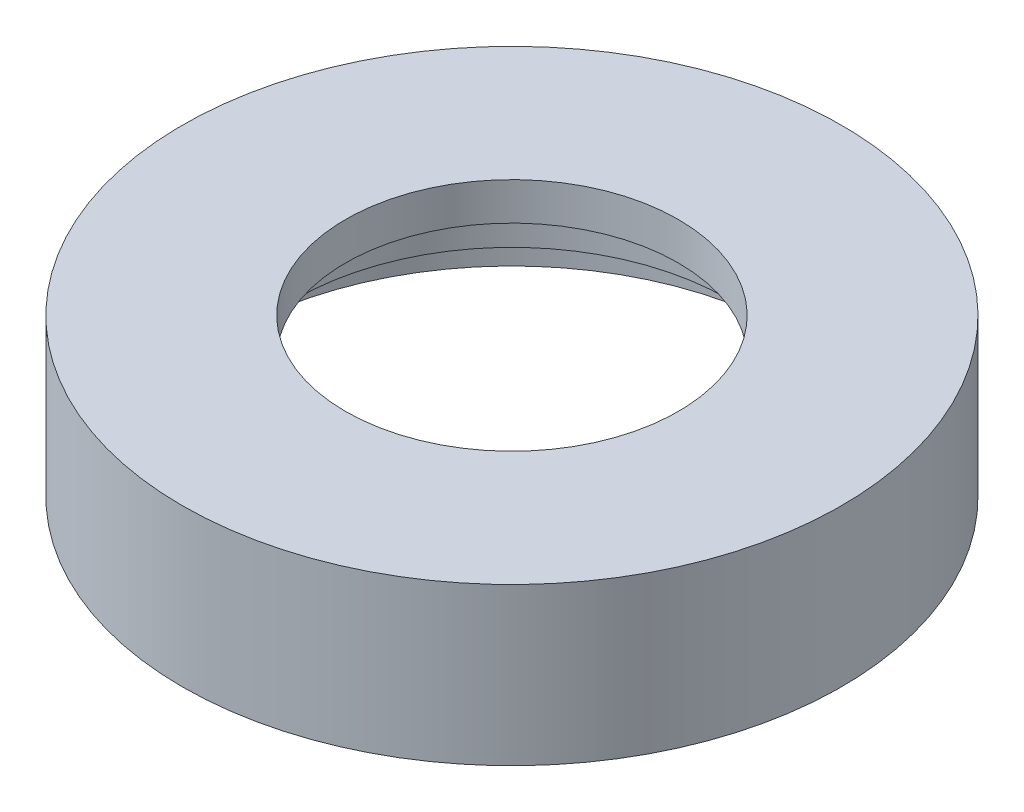
ISO-10303-21;
HEADER;
FILE_DESCRIPTION(('STEP AP214'),'2;1');
FILE_NAME('part.step','',(''),(''),'','','');
FILE_SCHEMA(('AUTOMOTIVE_DESIGN { 1 0 10303 214 1 1 1 1 }'));
ENDSEC;
DATA;
#1=APPLICATION_CONTEXT('core data for automotive mechanical design processes');
#2=APPLICATION_PROTOCOL_DEFINITION('international standard','automotive_design',2000,#1);
#3=PRODUCT_CONTEXT('',#1,'mechanical');
#4=PRODUCT('Part','Part','',(#3));
#5=PRODUCT_RELATED_PRODUCT_CATEGORY('part','',(#4));
#6=PRODUCT_DEFINITION_FORMATION('','',#4);
#7=PRODUCT_DEFINITION_CONTEXT('part definition',#1,'design');
#8=PRODUCT_DEFINITION('design','',#6,#7);
#9=PRODUCT_DEFINITION_SHAPE('','',#8);
#10=(LENGTH_UNIT() NAMED_UNIT(*) SI_UNIT(.MILLI.,.METRE.));
#11=(NAMED_UNIT(*) PLANE_ANGLE_UNIT() SI_UNIT($,.RADIAN.));
#12=(NAMED_UNIT(*) SI_UNIT($,.STERADIAN.) SOLID_ANGLE_UNIT());
#13=UNCERTAINTY_MEASURE_WITH_UNIT(LENGTH_MEASURE(1.E-05),#10,'distance_accuracy_value','');
#14=(GEOMETRIC_REPRESENTATION_CONTEXT(3) GLOBAL_UNCERTAINTY_ASSIGNED_CONTEXT((#13)) GLOBAL_UNIT_ASSIGNED_CONTEXT((#10,
#11,#12)) REPRESENTATION_CONTEXT('',''));
#15=CARTESIAN_POINT('',(0.,0.,0.));
#16=DIRECTION('',(0.,0.,1.));
#17=DIRECTION('',(1.,0.,0.));
#18=AXIS2_PLACEMENT_3D('',#15,#16,#17);
#19=CARTESIAN_POINT('',(0.,12.5,0.));
#20=DIRECTION('',(0.,-1.,0.));
#21=DIRECTION('',(0.,0.,-1.));
#22=AXIS2_PLACEMENT_3D('',#19,#20,#21);
#23=CYLINDRICAL_SURFACE('',#22,52.5);
#24=CARTESIAN_POINT('',(0.,12.5,0.));
#25=DIRECTION('',(0.,1.,0.));
#26=DIRECTION('',(0.,0.,1.));
#27=AXIS2_PLACEMENT_3D('',#24,#25,#26);
#28=CIRCLE('',#27,52.5);
#29=CARTESIAN_POINT('',(0.,12.5,52.5));
#30=VERTEX_POINT('',#29);
#31=EDGE_CURVE('E10',#30,#30,#28,.T.);
#32=ORIENTED_EDGE('',*,*,#31,.F.);
#33=EDGE_LOOP('',(#32));
#34=FACE_BOUND('',#33,.T.);
#35=CARTESIAN_POINT('',(0.,-12.5,0.));
#36=DIRECTION('',(0.,1.,0.));
#37=DIRECTION('',(0.,0.,1.));
#38=AXIS2_PLACEMENT_3D('',#35,#36,#37);
#39=CIRCLE('',#38,52.5);
#40=CARTESIAN_POINT('',(0.,-12.5,52.5));
#41=VERTEX_POINT('',#40);
#42=EDGE_CURVE('E44',#41,#41,#39,.T.);
#43=ORIENTED_EDGE('',*,*,#42,.T.);
#44=EDGE_LOOP('',(#43));
#45=FACE_BOUND('',#44,.T.);
#46=ADVANCED_FACE('F37',(#34,#45),#23,.T.);
#47=CARTESIAN_POINT('',(0.,12.5,0.));
#48=DIRECTION('',(0.,1.,0.));
#49=DIRECTION('',(0.,0.,1.));
#50=AXIS2_PLACEMENT_3D('',#47,#48,#49);
#51=PLANE('',#50);
#52=CARTESIAN_POINT('',(0.,12.5,0.));
#53=DIRECTION('',(0.,1.,0.));
#54=DIRECTION('',(0.,0.,1.));
#55=AXIS2_PLACEMENT_3D('',#52,#53,#54);
#56=CIRCLE('',#55,26.5);
#57=CARTESIAN_POINT('',(0.,12.5,26.5));
#58=VERTEX_POINT('',#57);
#59=EDGE_CURVE('E40',#58,#58,#56,.T.);
#60=ORIENTED_EDGE('',*,*,#59,.F.);
#61=EDGE_LOOP('',(#60));
#62=FACE_BOUND('',#61,.T.);
#63=ORIENTED_EDGE('',*,*,#31,.T.);
#64=EDGE_LOOP('',(#63));
#65=FACE_BOUND('',#64,.T.);
#66=ADVANCED_FACE('F71',(#62,#65),#51,.T.);
#67=CARTESIAN_POINT('',(0.,-12.5,0.));
#68=DIRECTION('',(0.,1.,0.));
#69=DIRECTION('',(0.,0.,1.));
#70=AXIS2_PLACEMENT_3D('',#67,#68,#69);
#71=PLANE('',#70);
#72=CARTESIAN_POINT('',(0.,-12.5,0.));
#73=DIRECTION('',(0.,-1.,0.));
#74=DIRECTION('',(0.,0.,-1.));
#75=AXIS2_PLACEMENT_3D('',#72,#73,#74);
#76=CIRCLE('',#75,45.);
#77=CARTESIAN_POINT('',(0.,-12.5,-45.));
#78=VERTEX_POINT('',#77);
#79=EDGE_CURVE('E51',#78,#78,#76,.T.);
#80=ORIENTED_EDGE('',*,*,#79,.F.);
#81=EDGE_LOOP('',(#80));
#82=FACE_BOUND('',#81,.T.);
#83=ORIENTED_EDGE('',*,*,#42,.F.);
#84=EDGE_LOOP('',(#83));
#85=FACE_BOUND('',#84,.T.);
#86=ADVANCED_FACE('F73',(#82,#85),#71,.F.);
#87=CARTESIAN_POINT('',(0.,-2.5,0.));
#88=DIRECTION('',(0.,-1.,0.));
#89=DIRECTION('',(0.,0.,-1.));
#90=AXIS2_PLACEMENT_3D('',#87,#88,#89);
#91=CYLINDRICAL_SURFACE('',#90,45.);
#92=CARTESIAN_POINT('',(0.,-2.5,0.));
#93=DIRECTION('',(0.,-1.,0.));
#94=DIRECTION('',(0.,0.,-1.));
#95=AXIS2_PLACEMENT_3D('',#92,#93,#94);
#96=CIRCLE('',#95,45.);
#97=CARTESIAN_POINT('',(0.,-2.5,-45.));
#98=VERTEX_POINT('',#97);
#99=EDGE_CURVE('E49',#98,#98,#96,.T.);
#100=ORIENTED_EDGE('',*,*,#99,.F.);
#101=EDGE_LOOP('',(#100));
#102=FACE_BOUND('',#101,.T.);
#103=ORIENTED_EDGE('',*,*,#79,.T.);
#104=EDGE_LOOP('',(#103));
#105=FACE_BOUND('',#104,.T.);
#106=ADVANCED_FACE('F80',(#102,#105),#91,.F.);
#107=CARTESIAN_POINT('',(0.,-2.5,0.));
#108=DIRECTION('',(0.,-1.,0.));
#109=DIRECTION('',(0.,0.,-1.));
#110=AXIS2_PLACEMENT_3D('',#107,#108,#109);
#111=PLANE('',#110);
#112=CARTESIAN_POINT('',(0.,-2.5,0.));
#113=DIRECTION('',(0.,-1.,0.));
#114=DIRECTION('',(0.,0.,-1.));
#115=AXIS2_PLACEMENT_3D('',#112,#113,#114);
#116=CIRCLE('',#115,34.5);
#117=CARTESIAN_POINT('',(0.,-2.5,-34.5));
#118=VERTEX_POINT('',#117);
#119=EDGE_CURVE('E57',#118,#118,#116,.T.);
#120=ORIENTED_EDGE('',*,*,#119,.F.);
#121=EDGE_LOOP('',(#120));
#122=FACE_BOUND('',#121,.T.);
#123=ORIENTED_EDGE('',*,*,#99,.T.);
#124=EDGE_LOOP('',(#123));
#125=FACE_BOUND('',#124,.T.);
#126=ADVANCED_FACE('F87',(#122,#125),#111,.T.);
#127=CARTESIAN_POINT('',(0.,6.5,0.));
#128=DIRECTION('',(0.,-1.,0.));
#129=DIRECTION('',(0.,0.,-1.));
#130=AXIS2_PLACEMENT_3D('',#127,#128,#129);
#131=CYLINDRICAL_SURFACE('',#130,34.5);
#132=CARTESIAN_POINT('',(0.,6.5,0.));
#133=DIRECTION('',(0.,-1.,0.));
#134=DIRECTION('',(0.,0.,-1.));
#135=AXIS2_PLACEMENT_3D('',#132,#133,#134);
#136=CIRCLE('',#135,34.5);
#137=CARTESIAN_POINT('',(0.,6.5,-34.5));
#138=VERTEX_POINT('',#137);
#139=EDGE_CURVE('E54',#138,#138,#136,.T.);
#140=ORIENTED_EDGE('',*,*,#139,.F.);
#141=EDGE_LOOP('',(#140));
#142=FACE_BOUND('',#141,.T.);
#143=ORIENTED_EDGE('',*,*,#119,.T.);
#144=EDGE_LOOP('',(#143));
#145=FACE_BOUND('',#144,.T.);
#146=ADVANCED_FACE('F91',(#142,#145),#131,.F.);
#147=CARTESIAN_POINT('',(0.,6.5,0.));
#148=DIRECTION('',(0.,-1.,0.));
#149=DIRECTION('',(0.,0.,-1.));
#150=AXIS2_PLACEMENT_3D('',#147,#148,#149);
#151=PLANE('',#150);
#152=CARTESIAN_POINT('',(0.,6.5,0.));
#153=DIRECTION('',(0.,-1.,0.));
#154=DIRECTION('',(0.,0.,-1.));
#155=AXIS2_PLACEMENT_3D('',#152,#153,#154);
#156=CIRCLE('',#155,26.5);
#157=CARTESIAN_POINT('',(0.,6.5,-26.5));
#158=VERTEX_POINT('',#157);
#159=EDGE_CURVE('E62',#158,#158,#156,.T.);
#160=ORIENTED_EDGE('',*,*,#159,.F.);
#161=EDGE_LOOP('',(#160));
#162=FACE_BOUND('',#161,.T.);
#163=ORIENTED_EDGE('',*,*,#139,.T.);
#164=EDGE_LOOP('',(#163));
#165=FACE_BOUND('',#164,.T.);
#166=ADVANCED_FACE('F94',(#162,#165),#151,.T.);
#167=CARTESIAN_POINT('',(0.,28.5,0.));
#168=DIRECTION('',(0.,-1.,0.));
#169=DIRECTION('',(0.,0.,-1.));
#170=AXIS2_PLACEMENT_3D('',#167,#168,#169);
#171=CYLINDRICAL_SURFACE('',#170,26.5);
#172=ORIENTED_EDGE('',*,*,#59,.T.);
#173=EDGE_LOOP('',(#172));
#174=FACE_BOUND('',#173,.T.);
#175=ORIENTED_EDGE('',*,*,#159,.T.);
#176=EDGE_LOOP('',(#175));
#177=FACE_BOUND('',#176,.T.);
#178=ADVANCED_FACE('F69',(#174,#177),#171,.F.);
#179=CLOSED_SHELL('',(#46,#66,#86,#106,#126,#146,#166,#178));
#180=MANIFOLD_SOLID_BREP('B2',#179);
#181=ADVANCED_BREP_SHAPE_REPRESENTATION('',(#18,#180),#14);
#182=SHAPE_DEFINITION_REPRESENTATION(#9,#181);
ENDSEC;
END-ISO-10303-21;
